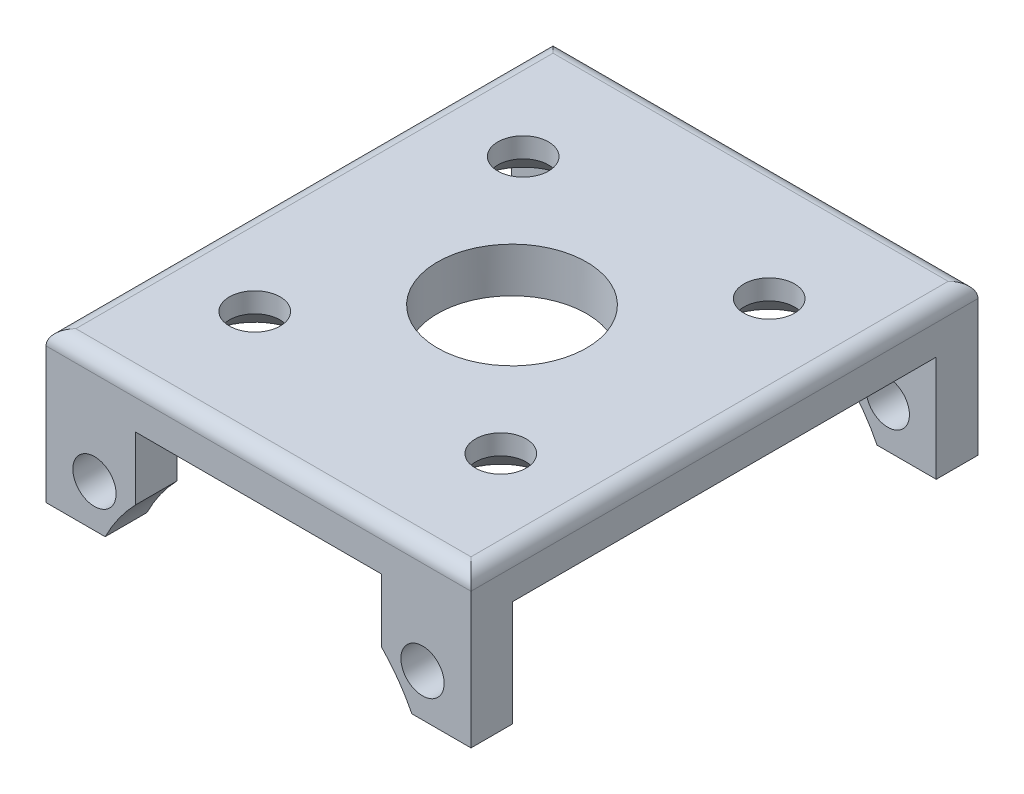
ISO-10303-21;
HEADER;
FILE_DESCRIPTION(('STEP AP214'),'2;1');
FILE_NAME('part.step','',(''),(''),'','','');
FILE_SCHEMA(('AUTOMOTIVE_DESIGN { 1 0 10303 214 1 1 1 1 }'));
ENDSEC;
DATA;
#1=APPLICATION_CONTEXT('core data for automotive mechanical design processes');
#2=APPLICATION_PROTOCOL_DEFINITION('international standard','automotive_design',2000,#1);
#3=PRODUCT_CONTEXT('',#1,'mechanical');
#4=PRODUCT('Part','Part','',(#3));
#5=PRODUCT_RELATED_PRODUCT_CATEGORY('part','',(#4));
#6=PRODUCT_DEFINITION_FORMATION('','',#4);
#7=PRODUCT_DEFINITION_CONTEXT('part definition',#1,'design');
#8=PRODUCT_DEFINITION('design','',#6,#7);
#9=PRODUCT_DEFINITION_SHAPE('','',#8);
#10=(LENGTH_UNIT() NAMED_UNIT(*) SI_UNIT(.MILLI.,.METRE.));
#11=(NAMED_UNIT(*) PLANE_ANGLE_UNIT() SI_UNIT($,.RADIAN.));
#12=(NAMED_UNIT(*) SI_UNIT($,.STERADIAN.) SOLID_ANGLE_UNIT());
#13=UNCERTAINTY_MEASURE_WITH_UNIT(LENGTH_MEASURE(1.E-05),#10,'distance_accuracy_value','');
#14=(GEOMETRIC_REPRESENTATION_CONTEXT(3) GLOBAL_UNCERTAINTY_ASSIGNED_CONTEXT((#13)) GLOBAL_UNIT_ASSIGNED_CONTEXT((#10,
#11,#12)) REPRESENTATION_CONTEXT('',''));
#15=CARTESIAN_POINT('',(0.,0.,0.));
#16=DIRECTION('',(0.,0.,1.));
#17=DIRECTION('',(1.,0.,0.));
#18=AXIS2_PLACEMENT_3D('',#15,#16,#17);
#19=CARTESIAN_POINT('',(8.25000000000001,0.,-17.));
#20=DIRECTION('',(1.,0.,0.));
#21=DIRECTION('',(0.,0.,-1.));
#22=AXIS2_PLACEMENT_3D('',#19,#20,#21);
#23=PLANE('',#22);
#24=DIRECTION('',(0.,0.,1.));
#25=VECTOR('',#24,1.);
#26=CARTESIAN_POINT('',(8.25000000000001,8.01171017948103,-17.));
#27=LINE('',#26,#25);
#28=CARTESIAN_POINT('',(8.25000000000001,8.01171017948103,-17.));
#29=VERTEX_POINT('',#28);
#30=CARTESIAN_POINT('',(8.25000000000001,8.01171017948103,-14.2));
#31=VERTEX_POINT('',#30);
#32=EDGE_CURVE('E271',#29,#31,#27,.T.);
#33=ORIENTED_EDGE('',*,*,#32,.T.);
#34=DIRECTION('',(0.,1.,0.));
#35=VECTOR('',#34,1.);
#36=CARTESIAN_POINT('',(8.25000000000001,0.,-14.2));
#37=LINE('',#36,#35);
#38=CARTESIAN_POINT('',(8.25000000000001,12.25,-14.2));
#39=VERTEX_POINT('',#38);
#40=EDGE_CURVE('E434',#31,#39,#37,.T.);
#41=ORIENTED_EDGE('',*,*,#40,.T.);
#42=DIRECTION('',(0.,0.,1.));
#43=VECTOR('',#42,1.);
#44=CARTESIAN_POINT('',(8.25000000000001,12.25,-17.));
#45=LINE('',#44,#43);
#46=CARTESIAN_POINT('',(8.25000000000001,12.25,-17.));
#47=VERTEX_POINT('',#46);
#48=EDGE_CURVE('E255',#47,#39,#45,.T.);
#49=ORIENTED_EDGE('',*,*,#48,.F.);
#50=DIRECTION('',(0.,1.,0.));
#51=VECTOR('',#50,1.);
#52=CARTESIAN_POINT('',(8.25000000000001,0.,-17.));
#53=LINE('',#52,#51);
#54=EDGE_CURVE('E231',#29,#47,#53,.T.);
#55=ORIENTED_EDGE('',*,*,#54,.F.);
#56=EDGE_LOOP('',(#33,#41,#49,#55));
#57=FACE_BOUND('',#56,.T.);
#58=ADVANCED_FACE('F47',(#57),#23,.F.);
#59=CARTESIAN_POINT('',(-8.25000000000001,0.,-17.));
#60=DIRECTION('',(1.,0.,0.));
#61=DIRECTION('',(0.,0.,-1.));
#62=AXIS2_PLACEMENT_3D('',#59,#60,#61);
#63=PLANE('',#62);
#64=DIRECTION('',(0.,1.,0.));
#65=VECTOR('',#64,1.);
#66=CARTESIAN_POINT('',(-8.25000000000001,0.,-14.2));
#67=LINE('',#66,#65);
#68=CARTESIAN_POINT('',(-8.25000000000001,8.01171017948103,-14.2));
#69=VERTEX_POINT('',#68);
#70=CARTESIAN_POINT('',(-8.25,12.25,-14.2));
#71=VERTEX_POINT('',#70);
#72=EDGE_CURVE('E446',#69,#71,#67,.T.);
#73=ORIENTED_EDGE('',*,*,#72,.F.);
#74=DIRECTION('',(0.,0.,1.));
#75=VECTOR('',#74,1.);
#76=CARTESIAN_POINT('',(-8.25000000000001,8.01171017948103,-17.));
#77=LINE('',#76,#75);
#78=CARTESIAN_POINT('',(-8.25000000000001,8.01171017948103,-17.));
#79=VERTEX_POINT('',#78);
#80=EDGE_CURVE('E266',#79,#69,#77,.T.);
#81=ORIENTED_EDGE('',*,*,#80,.F.);
#82=DIRECTION('',(0.,1.,0.));
#83=VECTOR('',#82,1.);
#84=CARTESIAN_POINT('',(-8.25000000000001,0.,-17.));
#85=LINE('',#84,#83);
#86=CARTESIAN_POINT('',(-8.25000000000001,12.25,-17.));
#87=VERTEX_POINT('',#86);
#88=EDGE_CURVE('E238',#79,#87,#85,.T.);
#89=ORIENTED_EDGE('',*,*,#88,.T.);
#90=DIRECTION('',(0.,0.,1.));
#91=VECTOR('',#90,1.);
#92=CARTESIAN_POINT('',(-8.25000000000001,12.25,-17.));
#93=LINE('',#92,#91);
#94=EDGE_CURVE('E261',#87,#71,#93,.T.);
#95=ORIENTED_EDGE('',*,*,#94,.T.);
#96=EDGE_LOOP('',(#73,#81,#89,#95));
#97=FACE_BOUND('',#96,.T.);
#98=ADVANCED_FACE('F495',(#97),#63,.T.);
#99=CARTESIAN_POINT('',(0.,0.,-17.));
#100=DIRECTION('',(0.,0.,1.));
#101=DIRECTION('',(1.,0.,0.));
#102=AXIS2_PLACEMENT_3D('',#99,#100,#101);
#103=CYLINDRICAL_SURFACE('',#102,11.5);
#104=CARTESIAN_POINT('',(0.,0.,-14.2));
#105=DIRECTION('',(0.,0.,-1.));
#106=DIRECTION('',(0.,1.,0.));
#107=AXIS2_PLACEMENT_3D('',#104,#105,#106);
#108=CIRCLE('',#107,11.5);
#109=CARTESIAN_POINT('',(-10.2823878549683,5.15,-14.2));
#110=VERTEX_POINT('',#109);
#111=EDGE_CURVE('E442',#69,#110,#108,.F.);
#112=ORIENTED_EDGE('',*,*,#111,.T.);
#113=DIRECTION('',(0.,0.,1.));
#114=VECTOR('',#113,1.);
#115=CARTESIAN_POINT('',(-10.2823878549683,5.15,-17.));
#116=LINE('',#115,#114);
#117=CARTESIAN_POINT('',(-10.2823878549683,5.15,-17.));
#118=VERTEX_POINT('',#117);
#119=EDGE_CURVE('E502',#110,#118,#116,.F.);
#120=ORIENTED_EDGE('',*,*,#119,.T.);
#121=CARTESIAN_POINT('',(0.,0.,-17.));
#122=DIRECTION('',(0.,0.,1.));
#123=DIRECTION('',(1.,0.,0.));
#124=AXIS2_PLACEMENT_3D('',#121,#122,#123);
#125=CIRCLE('',#124,11.5);
#126=EDGE_CURVE('E229',#79,#118,#125,.T.);
#127=ORIENTED_EDGE('',*,*,#126,.F.);
#128=ORIENTED_EDGE('',*,*,#80,.T.);
#129=EDGE_LOOP('',(#112,#120,#127,#128));
#130=FACE_BOUND('',#129,.T.);
#131=ADVANCED_FACE('F501',(#130),#103,.F.);
#132=CARTESIAN_POINT('',(-11.,8.,-17.));
#133=DIRECTION('',(0.,0.,1.));
#134=DIRECTION('',(1.,0.,0.));
#135=AXIS2_PLACEMENT_3D('',#132,#133,#134);
#136=CYLINDRICAL_SURFACE('',#135,1.45);
#137=CARTESIAN_POINT('',(-11.,8.,-14.2));
#138=DIRECTION('',(0.,0.,-1.));
#139=DIRECTION('',(0.,1.,0.));
#140=AXIS2_PLACEMENT_3D('',#137,#138,#139);
#141=CIRCLE('',#140,1.45);
#142=CARTESIAN_POINT('',(-11.,9.45,-14.2));
#143=VERTEX_POINT('',#142);
#144=EDGE_CURVE('E438',#143,#143,#141,.F.);
#145=ORIENTED_EDGE('',*,*,#144,.T.);
#146=EDGE_LOOP('',(#145));
#147=FACE_BOUND('',#146,.T.);
#148=CARTESIAN_POINT('',(-11.,8.,-17.));
#149=DIRECTION('',(0.,0.,1.));
#150=DIRECTION('',(1.,0.,0.));
#151=AXIS2_PLACEMENT_3D('',#148,#149,#150);
#152=CIRCLE('',#151,1.45);
#153=CARTESIAN_POINT('',(-9.55000000000001,8.,-17.));
#154=VERTEX_POINT('',#153);
#155=EDGE_CURVE('E246',#154,#154,#152,.T.);
#156=ORIENTED_EDGE('',*,*,#155,.F.);
#157=EDGE_LOOP('',(#156));
#158=FACE_BOUND('',#157,.T.);
#159=ADVANCED_FACE('F618',(#147,#158),#136,.F.);
#160=CARTESIAN_POINT('',(0.,0.,-17.));
#161=DIRECTION('',(0.,0.,1.));
#162=DIRECTION('',(1.,0.,0.));
#163=AXIS2_PLACEMENT_3D('',#160,#161,#162);
#164=CYLINDRICAL_SURFACE('',#163,11.5);
#165=CARTESIAN_POINT('',(0.,0.,-17.));
#166=DIRECTION('',(0.,0.,1.));
#167=DIRECTION('',(1.,0.,0.));
#168=AXIS2_PLACEMENT_3D('',#165,#166,#167);
#169=CIRCLE('',#168,11.5);
#170=CARTESIAN_POINT('',(10.2823878549683,5.15,-17.));
#171=VERTEX_POINT('',#170);
#172=EDGE_CURVE('E225',#171,#29,#169,.T.);
#173=ORIENTED_EDGE('',*,*,#172,.F.);
#174=DIRECTION('',(0.,0.,1.));
#175=VECTOR('',#174,1.);
#176=CARTESIAN_POINT('',(10.2823878549683,5.15,-17.));
#177=LINE('',#176,#175);
#178=CARTESIAN_POINT('',(10.2823878549683,5.15,-14.2));
#179=VERTEX_POINT('',#178);
#180=EDGE_CURVE('E198',#171,#179,#177,.T.);
#181=ORIENTED_EDGE('',*,*,#180,.T.);
#182=CARTESIAN_POINT('',(0.,0.,-14.2));
#183=DIRECTION('',(0.,0.,-1.));
#184=DIRECTION('',(0.,1.,0.));
#185=AXIS2_PLACEMENT_3D('',#182,#183,#184);
#186=CIRCLE('',#185,11.5);
#187=EDGE_CURVE('E285',#179,#31,#186,.F.);
#188=ORIENTED_EDGE('',*,*,#187,.T.);
#189=ORIENTED_EDGE('',*,*,#32,.F.);
#190=EDGE_LOOP('',(#173,#181,#188,#189));
#191=FACE_BOUND('',#190,.T.);
#192=ADVANCED_FACE('F610',(#191),#164,.F.);
#193=CARTESIAN_POINT('',(11.,8.00000000000031,-17.));
#194=DIRECTION('',(0.,0.,1.));
#195=DIRECTION('',(1.,0.,0.));
#196=AXIS2_PLACEMENT_3D('',#193,#194,#195);
#197=CYLINDRICAL_SURFACE('',#196,1.45);
#198=CARTESIAN_POINT('',(11.,8.00000000000031,-14.2));
#199=DIRECTION('',(0.,0.,-1.));
#200=DIRECTION('',(0.,1.,0.));
#201=AXIS2_PLACEMENT_3D('',#198,#199,#200);
#202=CIRCLE('',#201,1.45);
#203=CARTESIAN_POINT('',(11.,9.45000000000031,-14.2));
#204=VERTEX_POINT('',#203);
#205=EDGE_CURVE('E281',#204,#204,#202,.F.);
#206=ORIENTED_EDGE('',*,*,#205,.T.);
#207=EDGE_LOOP('',(#206));
#208=FACE_BOUND('',#207,.T.);
#209=CARTESIAN_POINT('',(11.,8.00000000000031,-17.));
#210=DIRECTION('',(0.,0.,1.));
#211=DIRECTION('',(1.,0.,0.));
#212=AXIS2_PLACEMENT_3D('',#209,#210,#211);
#213=CIRCLE('',#212,1.45);
#214=CARTESIAN_POINT('',(12.45,8.00000000000031,-17.));
#215=VERTEX_POINT('',#214);
#216=EDGE_CURVE('E250',#215,#215,#213,.T.);
#217=ORIENTED_EDGE('',*,*,#216,.F.);
#218=EDGE_LOOP('',(#217));
#219=FACE_BOUND('',#218,.T.);
#220=ADVANCED_FACE('F602',(#208,#219),#197,.F.);
#221=CARTESIAN_POINT('',(8.25000000000001,12.25,14.2));
#222=VERTEX_POINT('',#221);
#223=CARTESIAN_POINT('',(8.25000000000001,12.25,17.));
#224=VERTEX_POINT('',#223);
#225=EDGE_CURVE('E260',#222,#224,#45,.T.);
#226=ORIENTED_EDGE('',*,*,#225,.F.);
#227=DIRECTION('',(0.,-1.,0.));
#228=VECTOR('',#227,1.);
#229=CARTESIAN_POINT('',(8.25000000000001,0.,14.2));
#230=LINE('',#229,#228);
#231=CARTESIAN_POINT('',(8.25000000000001,8.01171017948103,14.2));
#232=VERTEX_POINT('',#231);
#233=EDGE_CURVE('E418',#222,#232,#230,.T.);
#234=ORIENTED_EDGE('',*,*,#233,.T.);
#235=CARTESIAN_POINT('',(8.25000000000001,8.01171017948103,17.));
#236=VERTEX_POINT('',#235);
#237=EDGE_CURVE('E254',#232,#236,#27,.T.);
#238=ORIENTED_EDGE('',*,*,#237,.T.);
#239=DIRECTION('',(0.,1.,0.));
#240=VECTOR('',#239,1.);
#241=CARTESIAN_POINT('',(8.25000000000001,0.,17.));
#242=LINE('',#241,#240);
#243=EDGE_CURVE('E449',#236,#224,#242,.T.);
#244=ORIENTED_EDGE('',*,*,#243,.T.);
#245=EDGE_LOOP('',(#226,#234,#238,#244));
#246=FACE_BOUND('',#245,.T.);
#247=ADVANCED_FACE('F537',(#246),#23,.F.);
#248=CARTESIAN_POINT('',(0.,12.25,-17.));
#249=DIRECTION('',(0.,-1.,0.));
#250=DIRECTION('',(0.,0.,-1.));
#251=AXIS2_PLACEMENT_3D('',#248,#249,#250);
#252=PLANE('',#251);
#253=CARTESIAN_POINT('',(-8.25000000000001,12.25,9.));
#254=DIRECTION('',(0.,-1.,0.));
#255=DIRECTION('',(0.,0.,-1.));
#256=AXIS2_PLACEMENT_3D('',#253,#254,#255);
#257=CIRCLE('',#256,3.36);
#258=CARTESIAN_POINT('',(-8.25000000000001,12.25,5.64));
#259=VERTEX_POINT('',#258);
#260=EDGE_CURVE('E324',#259,#259,#257,.T.);
#261=ORIENTED_EDGE('',*,*,#260,.F.);
#262=EDGE_LOOP('',(#261));
#263=FACE_BOUND('',#262,.T.);
#264=CARTESIAN_POINT('',(8.25000000000001,12.25,9.));
#265=DIRECTION('',(0.,-1.,0.));
#266=DIRECTION('',(0.,0.,-1.));
#267=AXIS2_PLACEMENT_3D('',#264,#265,#266);
#268=CIRCLE('',#267,3.36);
#269=CARTESIAN_POINT('',(8.25000000000001,12.25,5.64));
#270=VERTEX_POINT('',#269);
#271=EDGE_CURVE('E344',#270,#270,#268,.T.);
#272=ORIENTED_EDGE('',*,*,#271,.F.);
#273=EDGE_LOOP('',(#272));
#274=FACE_BOUND('',#273,.T.);
#275=CARTESIAN_POINT('',(-8.25000000000001,12.25,-9.));
#276=DIRECTION('',(0.,-1.,0.));
#277=DIRECTION('',(0.,0.,-1.));
#278=AXIS2_PLACEMENT_3D('',#275,#276,#277);
#279=CIRCLE('',#278,3.36);
#280=CARTESIAN_POINT('',(-8.25000000000001,12.25,-12.36));
#281=VERTEX_POINT('',#280);
#282=EDGE_CURVE('E356',#281,#281,#279,.T.);
#283=ORIENTED_EDGE('',*,*,#282,.F.);
#284=EDGE_LOOP('',(#283));
#285=FACE_BOUND('',#284,.T.);
#286=CARTESIAN_POINT('',(8.25000000000001,12.25,-9.));
#287=DIRECTION('',(0.,-1.,0.));
#288=DIRECTION('',(0.,0.,-1.));
#289=AXIS2_PLACEMENT_3D('',#286,#287,#288);
#290=CIRCLE('',#289,3.36);
#291=CARTESIAN_POINT('',(8.25000000000001,12.25,-12.36));
#292=VERTEX_POINT('',#291);
#293=EDGE_CURVE('E368',#292,#292,#290,.T.);
#294=ORIENTED_EDGE('',*,*,#293,.F.);
#295=EDGE_LOOP('',(#294));
#296=FACE_BOUND('',#295,.T.);
#297=CARTESIAN_POINT('',(0.,12.25,0.));
#298=DIRECTION('',(0.,-1.,0.));
#299=DIRECTION('',(0.,0.,-1.));
#300=AXIS2_PLACEMENT_3D('',#297,#298,#299);
#301=CIRCLE('',#300,5.);
#302=CARTESIAN_POINT('',(0.,12.25,-5.));
#303=VERTEX_POINT('',#302);
#304=EDGE_CURVE('E384',#303,#303,#301,.T.);
#305=ORIENTED_EDGE('',*,*,#304,.F.);
#306=EDGE_LOOP('',(#305));
#307=FACE_BOUND('',#306,.T.);
#308=CARTESIAN_POINT('',(-8.25,12.25,14.2));
#309=VERTEX_POINT('',#308);
#310=CARTESIAN_POINT('',(-8.25000000000001,12.25,17.));
#311=VERTEX_POINT('',#310);
#312=EDGE_CURVE('E265',#309,#311,#93,.T.);
#313=ORIENTED_EDGE('',*,*,#312,.F.);
#314=DIRECTION('',(-1.,0.,0.));
#315=VECTOR('',#314,1.);
#316=CARTESIAN_POINT('',(14.25,12.25,14.2));
#317=LINE('',#316,#315);
#318=CARTESIAN_POINT('',(-14.25,12.25,14.2));
#319=VERTEX_POINT('',#318);
#320=EDGE_CURVE('E398',#309,#319,#317,.T.);
#321=ORIENTED_EDGE('',*,*,#320,.T.);
#322=DIRECTION('',(0.,0.,-1.));
#323=VECTOR('',#322,1.);
#324=CARTESIAN_POINT('',(-14.25,12.25,-14.2));
#325=LINE('',#324,#323);
#326=CARTESIAN_POINT('',(-14.25,12.25,-14.2));
#327=VERTEX_POINT('',#326);
#328=EDGE_CURVE('E392',#319,#327,#325,.T.);
#329=ORIENTED_EDGE('',*,*,#328,.T.);
#330=DIRECTION('',(-1.,0.,0.));
#331=VECTOR('',#330,1.);
#332=CARTESIAN_POINT('',(14.25,12.25,-14.2));
#333=LINE('',#332,#331);
#334=EDGE_CURVE('E410',#71,#327,#333,.T.);
#335=ORIENTED_EDGE('',*,*,#334,.F.);
#336=ORIENTED_EDGE('',*,*,#94,.F.);
#337=DIRECTION('',(1.,0.,0.));
#338=VECTOR('',#337,1.);
#339=CARTESIAN_POINT('',(0.,12.25,-17.));
#340=LINE('',#339,#338);
#341=EDGE_CURVE('E242',#87,#47,#340,.T.);
#342=ORIENTED_EDGE('',*,*,#341,.T.);
#343=ORIENTED_EDGE('',*,*,#48,.T.);
#344=CARTESIAN_POINT('',(14.25,12.25,-14.2));
#345=VERTEX_POINT('',#344);
#346=EDGE_CURVE('E280',#345,#39,#333,.T.);
#347=ORIENTED_EDGE('',*,*,#346,.F.);
#348=DIRECTION('',(0.,0.,-1.));
#349=VECTOR('',#348,1.);
#350=CARTESIAN_POINT('',(14.25,12.25,-14.2));
#351=LINE('',#350,#349);
#352=CARTESIAN_POINT('',(14.25,12.25,14.2));
#353=VERTEX_POINT('',#352);
#354=EDGE_CURVE('E395',#353,#345,#351,.T.);
#355=ORIENTED_EDGE('',*,*,#354,.F.);
#356=EDGE_CURVE('E411',#353,#222,#317,.T.);
#357=ORIENTED_EDGE('',*,*,#356,.T.);
#358=ORIENTED_EDGE('',*,*,#225,.T.);
#359=DIRECTION('',(1.,0.,0.));
#360=VECTOR('',#359,1.);
#361=CARTESIAN_POINT('',(0.,12.25,17.));
#362=LINE('',#361,#360);
#363=EDGE_CURVE('E470',#311,#224,#362,.T.);
#364=ORIENTED_EDGE('',*,*,#363,.F.);
#365=EDGE_LOOP('',(#313,#321,#329,#335,#336,#342,#343,#347,#355,#357,#358,#364));
#366=FACE_BOUND('',#365,.T.);
#367=ADVANCED_FACE('F491',(#263,#274,#285,#296,#307,#366),#252,.T.);
#368=DIRECTION('',(0.,-1.,0.));
#369=VECTOR('',#368,1.);
#370=CARTESIAN_POINT('',(-8.25000000000001,0.,14.2));
#371=LINE('',#370,#369);
#372=CARTESIAN_POINT('',(-8.25000000000001,8.01171017948103,14.2));
#373=VERTEX_POINT('',#372);
#374=EDGE_CURVE('E286',#309,#373,#371,.T.);
#375=ORIENTED_EDGE('',*,*,#374,.F.);
#376=ORIENTED_EDGE('',*,*,#312,.T.);
#377=DIRECTION('',(0.,1.,0.));
#378=VECTOR('',#377,1.);
#379=CARTESIAN_POINT('',(-8.25000000000001,0.,17.));
#380=LINE('',#379,#378);
#381=CARTESIAN_POINT('',(-8.25000000000001,8.01171017948103,17.));
#382=VERTEX_POINT('',#381);
#383=EDGE_CURVE('E466',#382,#311,#380,.T.);
#384=ORIENTED_EDGE('',*,*,#383,.F.);
#385=EDGE_CURVE('E270',#373,#382,#77,.T.);
#386=ORIENTED_EDGE('',*,*,#385,.F.);
#387=EDGE_LOOP('',(#375,#376,#384,#386));
#388=FACE_BOUND('',#387,.T.);
#389=ADVANCED_FACE('F598',(#388),#63,.T.);
#390=CARTESIAN_POINT('',(0.,0.,17.));
#391=DIRECTION('',(0.,0.,1.));
#392=DIRECTION('',(1.,0.,0.));
#393=AXIS2_PLACEMENT_3D('',#390,#391,#392);
#394=CIRCLE('',#393,11.5);
#395=CARTESIAN_POINT('',(-10.2823878549683,5.15,17.));
#396=VERTEX_POINT('',#395);
#397=EDGE_CURVE('E462',#382,#396,#394,.T.);
#398=ORIENTED_EDGE('',*,*,#397,.T.);
#399=DIRECTION('',(0.,0.,1.));
#400=VECTOR('',#399,1.);
#401=CARTESIAN_POINT('',(-10.2823878549683,5.15,-17.));
#402=LINE('',#401,#400);
#403=CARTESIAN_POINT('',(-10.2823878549683,5.15,14.2));
#404=VERTEX_POINT('',#403);
#405=EDGE_CURVE('E512',#396,#404,#402,.F.);
#406=ORIENTED_EDGE('',*,*,#405,.T.);
#407=CARTESIAN_POINT('',(0.,0.,14.2));
#408=DIRECTION('',(0.,0.,1.));
#409=DIRECTION('',(1.,0.,0.));
#410=AXIS2_PLACEMENT_3D('',#407,#408,#409);
#411=CIRCLE('',#410,11.5);
#412=EDGE_CURVE('E426',#404,#373,#411,.F.);
#413=ORIENTED_EDGE('',*,*,#412,.T.);
#414=ORIENTED_EDGE('',*,*,#385,.T.);
#415=EDGE_LOOP('',(#398,#406,#413,#414));
#416=FACE_BOUND('',#415,.T.);
#417=ADVANCED_FACE('F705',(#416),#103,.F.);
#418=CARTESIAN_POINT('',(-14.25,0.,-17.));
#419=DIRECTION('',(1.,0.,0.));
#420=DIRECTION('',(0.,1.,0.));
#421=AXIS2_PLACEMENT_3D('',#418,#419,#420);
#422=PLANE('',#421);
#423=DIRECTION('',(0.,1.,0.));
#424=VECTOR('',#423,1.);
#425=CARTESIAN_POINT('',(-14.25,0.,-17.));
#426=LINE('',#425,#424);
#427=CARTESIAN_POINT('',(-14.25,5.15,-17.));
#428=VERTEX_POINT('',#427);
#429=CARTESIAN_POINT('',(-14.25,14.25,-17.));
#430=VERTEX_POINT('',#429);
#431=EDGE_CURVE('E224',#428,#430,#426,.T.);
#432=ORIENTED_EDGE('',*,*,#431,.F.);
#433=DIRECTION('',(0.,0.,1.));
#434=VECTOR('',#433,1.);
#435=CARTESIAN_POINT('',(-14.25,5.15,-17.));
#436=LINE('',#435,#434);
#437=CARTESIAN_POINT('',(-14.25,5.15,-14.2));
#438=VERTEX_POINT('',#437);
#439=EDGE_CURVE('E548',#428,#438,#436,.T.);
#440=ORIENTED_EDGE('',*,*,#439,.T.);
#441=DIRECTION('',(0.,-1.,0.));
#442=VECTOR('',#441,1.);
#443=CARTESIAN_POINT('',(-14.25,12.25,-14.2));
#444=LINE('',#443,#442);
#445=EDGE_CURVE('E388',#327,#438,#444,.T.);
#446=ORIENTED_EDGE('',*,*,#445,.F.);
#447=ORIENTED_EDGE('',*,*,#328,.F.);
#448=DIRECTION('',(0.,1.,0.));
#449=VECTOR('',#448,1.);
#450=CARTESIAN_POINT('',(-14.25,12.25,14.2));
#451=LINE('',#450,#449);
#452=CARTESIAN_POINT('',(-14.25,5.15,14.2));
#453=VERTEX_POINT('',#452);
#454=EDGE_CURVE('E402',#453,#319,#451,.T.);
#455=ORIENTED_EDGE('',*,*,#454,.F.);
#456=CARTESIAN_POINT('',(-14.25,5.15,17.));
#457=VERTEX_POINT('',#456);
#458=EDGE_CURVE('E216',#453,#457,#436,.T.);
#459=ORIENTED_EDGE('',*,*,#458,.T.);
#460=DIRECTION('',(0.,1.,0.));
#461=VECTOR('',#460,1.);
#462=CARTESIAN_POINT('',(-14.25,0.,17.));
#463=LINE('',#462,#461);
#464=CARTESIAN_POINT('',(-14.25,14.25,17.));
#465=VERTEX_POINT('',#464);
#466=EDGE_CURVE('E459',#457,#465,#463,.T.);
#467=ORIENTED_EDGE('',*,*,#466,.T.);
#468=DIRECTION('',(0.,0.,1.));
#469=VECTOR('',#468,1.);
#470=CARTESIAN_POINT('',(-14.25,14.25,-17.));
#471=LINE('',#470,#469);
#472=EDGE_CURVE('E302',#465,#430,#471,.F.);
#473=ORIENTED_EDGE('',*,*,#472,.T.);
#474=EDGE_LOOP('',(#432,#440,#446,#447,#455,#459,#467,#473));
#475=FACE_BOUND('',#474,.T.);
#476=ADVANCED_FACE('F562',(#475),#422,.F.);
#477=CARTESIAN_POINT('',(0.,15.25,-17.));
#478=DIRECTION('',(0.,1.,0.));
#479=DIRECTION('',(0.,0.,1.));
#480=AXIS2_PLACEMENT_3D('',#477,#478,#479);
#481=PLANE('',#480);
#482=DIRECTION('',(0.,0.,1.));
#483=VECTOR('',#482,1.);
#484=CARTESIAN_POINT('',(13.25,15.25,-17.));
#485=LINE('',#484,#483);
#486=CARTESIAN_POINT('',(13.25,15.25,16.));
#487=VERTEX_POINT('',#486);
#488=CARTESIAN_POINT('',(13.25,15.25,-16.));
#489=VERTEX_POINT('',#488);
#490=EDGE_CURVE('E295',#487,#489,#485,.F.);
#491=ORIENTED_EDGE('',*,*,#490,.T.);
#492=DIRECTION('',(-1.,0.,0.));
#493=VECTOR('',#492,1.);
#494=CARTESIAN_POINT('',(-14.25,15.25,-16.));
#495=LINE('',#494,#493);
#496=CARTESIAN_POINT('',(-13.25,15.25,-16.));
#497=VERTEX_POINT('',#496);
#498=EDGE_CURVE('E299',#489,#497,#495,.T.);
#499=ORIENTED_EDGE('',*,*,#498,.T.);
#500=DIRECTION('',(0.,0.,1.));
#501=VECTOR('',#500,1.);
#502=CARTESIAN_POINT('',(-13.25,15.25,17.));
#503=LINE('',#502,#501);
#504=CARTESIAN_POINT('',(-13.25,15.25,16.));
#505=VERTEX_POINT('',#504);
#506=EDGE_CURVE('E292',#497,#505,#503,.T.);
#507=ORIENTED_EDGE('',*,*,#506,.T.);
#508=DIRECTION('',(-1.,0.,0.));
#509=VECTOR('',#508,1.);
#510=CARTESIAN_POINT('',(0.,15.25,16.));
#511=LINE('',#510,#509);
#512=EDGE_CURVE('E289',#505,#487,#511,.F.);
#513=ORIENTED_EDGE('',*,*,#512,.T.);
#514=EDGE_LOOP('',(#491,#499,#507,#513));
#515=FACE_BOUND('',#514,.T.);
#516=CARTESIAN_POINT('',(-8.25000000000001,15.25,9.));
#517=DIRECTION('',(0.,-1.,0.));
#518=DIRECTION('',(0.,0.,-1.));
#519=AXIS2_PLACEMENT_3D('',#516,#517,#518);
#520=CIRCLE('',#519,1.7);
#521=CARTESIAN_POINT('',(-8.25000000000001,15.25,7.3));
#522=VERTEX_POINT('',#521);
#523=EDGE_CURVE('E336',#522,#522,#520,.T.);
#524=ORIENTED_EDGE('',*,*,#523,.T.);
#525=EDGE_LOOP('',(#524));
#526=FACE_BOUND('',#525,.T.);
#527=CARTESIAN_POINT('',(8.25000000000001,15.25,9.));
#528=DIRECTION('',(0.,-1.,0.));
#529=DIRECTION('',(0.,0.,-1.));
#530=AXIS2_PLACEMENT_3D('',#527,#528,#529);
#531=CIRCLE('',#530,1.7);
#532=CARTESIAN_POINT('',(8.25000000000001,15.25,7.3));
#533=VERTEX_POINT('',#532);
#534=EDGE_CURVE('E352',#533,#533,#531,.T.);
#535=ORIENTED_EDGE('',*,*,#534,.T.);
#536=EDGE_LOOP('',(#535));
#537=FACE_BOUND('',#536,.T.);
#538=CARTESIAN_POINT('',(-8.25000000000001,15.25,-9.));
#539=DIRECTION('',(0.,-1.,0.));
#540=DIRECTION('',(0.,0.,-1.));
#541=AXIS2_PLACEMENT_3D('',#538,#539,#540);
#542=CIRCLE('',#541,1.7);
#543=CARTESIAN_POINT('',(-8.25000000000001,15.25,-10.7));
#544=VERTEX_POINT('',#543);
#545=EDGE_CURVE('E364',#544,#544,#542,.T.);
#546=ORIENTED_EDGE('',*,*,#545,.T.);
#547=EDGE_LOOP('',(#546));
#548=FACE_BOUND('',#547,.T.);
#549=CARTESIAN_POINT('',(8.25000000000001,15.25,-9.));
#550=DIRECTION('',(0.,-1.,0.));
#551=DIRECTION('',(0.,0.,-1.));
#552=AXIS2_PLACEMENT_3D('',#549,#550,#551);
#553=CIRCLE('',#552,1.7);
#554=CARTESIAN_POINT('',(8.25000000000001,15.25,-10.7));
#555=VERTEX_POINT('',#554);
#556=EDGE_CURVE('E376',#555,#555,#553,.T.);
#557=ORIENTED_EDGE('',*,*,#556,.T.);
#558=EDGE_LOOP('',(#557));
#559=FACE_BOUND('',#558,.T.);
#560=CARTESIAN_POINT('',(0.,15.25,0.));
#561=DIRECTION('',(0.,1.,0.));
#562=DIRECTION('',(0.,0.,1.));
#563=AXIS2_PLACEMENT_3D('',#560,#561,#562);
#564=CIRCLE('',#563,5.);
#565=CARTESIAN_POINT('',(0.,15.25,5.));
#566=VERTEX_POINT('',#565);
#567=EDGE_CURVE('E380',#566,#566,#564,.T.);
#568=ORIENTED_EDGE('',*,*,#567,.F.);
#569=EDGE_LOOP('',(#568));
#570=FACE_BOUND('',#569,.T.);
#571=ADVANCED_FACE('F579',(#515,#526,#537,#548,#559,#570),#481,.T.);
#572=CARTESIAN_POINT('',(14.25,0.,-17.));
#573=DIRECTION('',(1.,0.,0.));
#574=DIRECTION('',(0.,1.,0.));
#575=AXIS2_PLACEMENT_3D('',#572,#573,#574);
#576=PLANE('',#575);
#577=DIRECTION('',(0.,0.,1.));
#578=VECTOR('',#577,1.);
#579=CARTESIAN_POINT('',(14.25,5.15,-17.));
#580=LINE('',#579,#578);
#581=CARTESIAN_POINT('',(14.25,5.15,-17.));
#582=VERTEX_POINT('',#581);
#583=CARTESIAN_POINT('',(14.25,5.15,-14.2));
#584=VERTEX_POINT('',#583);
#585=EDGE_CURVE('E71',#582,#584,#580,.T.);
#586=ORIENTED_EDGE('',*,*,#585,.F.);
#587=DIRECTION('',(0.,1.,0.));
#588=VECTOR('',#587,1.);
#589=CARTESIAN_POINT('',(14.25,0.,-17.));
#590=LINE('',#589,#588);
#591=CARTESIAN_POINT('',(14.25,14.25,-17.));
#592=VERTEX_POINT('',#591);
#593=EDGE_CURVE('E210',#582,#592,#590,.T.);
#594=ORIENTED_EDGE('',*,*,#593,.T.);
#595=DIRECTION('',(0.,0.,1.));
#596=VECTOR('',#595,1.);
#597=CARTESIAN_POINT('',(14.25,14.25,-17.));
#598=LINE('',#597,#596);
#599=CARTESIAN_POINT('',(14.25,14.25,17.));
#600=VERTEX_POINT('',#599);
#601=EDGE_CURVE('E259',#592,#600,#598,.T.);
#602=ORIENTED_EDGE('',*,*,#601,.T.);
#603=DIRECTION('',(0.,1.,0.));
#604=VECTOR('',#603,1.);
#605=CARTESIAN_POINT('',(14.25,0.,17.));
#606=LINE('',#605,#604);
#607=CARTESIAN_POINT('',(14.25,5.15,17.));
#608=VERTEX_POINT('',#607);
#609=EDGE_CURVE('E456',#608,#600,#606,.T.);
#610=ORIENTED_EDGE('',*,*,#609,.F.);
#611=CARTESIAN_POINT('',(14.25,5.15,14.2));
#612=VERTEX_POINT('',#611);
#613=EDGE_CURVE('E203',#612,#608,#580,.T.);
#614=ORIENTED_EDGE('',*,*,#613,.F.);
#615=DIRECTION('',(0.,1.,0.));
#616=VECTOR('',#615,1.);
#617=CARTESIAN_POINT('',(14.25,12.25,14.2));
#618=LINE('',#617,#616);
#619=EDGE_CURVE('E391',#612,#353,#618,.T.);
#620=ORIENTED_EDGE('',*,*,#619,.T.);
#621=ORIENTED_EDGE('',*,*,#354,.T.);
#622=DIRECTION('',(0.,-1.,0.));
#623=VECTOR('',#622,1.);
#624=CARTESIAN_POINT('',(14.25,12.25,-14.2));
#625=LINE('',#624,#623);
#626=EDGE_CURVE('E214',#345,#584,#625,.T.);
#627=ORIENTED_EDGE('',*,*,#626,.T.);
#628=EDGE_LOOP('',(#586,#594,#602,#610,#614,#620,#621,#627));
#629=FACE_BOUND('',#628,.T.);
#630=ADVANCED_FACE('F208',(#629),#576,.T.);
#631=CARTESIAN_POINT('',(-11.,8.,14.2));
#632=DIRECTION('',(0.,0.,1.));
#633=DIRECTION('',(1.,0.,0.));
#634=AXIS2_PLACEMENT_3D('',#631,#632,#633);
#635=CIRCLE('',#634,1.45);
#636=CARTESIAN_POINT('',(-9.55000000000001,8.,14.2));
#637=VERTEX_POINT('',#636);
#638=EDGE_CURVE('E422',#637,#637,#635,.F.);
#639=ORIENTED_EDGE('',*,*,#638,.T.);
#640=EDGE_LOOP('',(#639));
#641=FACE_BOUND('',#640,.T.);
#642=CARTESIAN_POINT('',(-11.,8.,17.));
#643=DIRECTION('',(0.,0.,1.));
#644=DIRECTION('',(1.,0.,0.));
#645=AXIS2_PLACEMENT_3D('',#642,#643,#644);
#646=CIRCLE('',#645,1.45);
#647=CARTESIAN_POINT('',(-9.55000000000001,8.,17.));
#648=VERTEX_POINT('',#647);
#649=EDGE_CURVE('E474',#648,#648,#646,.T.);
#650=ORIENTED_EDGE('',*,*,#649,.T.);
#651=EDGE_LOOP('',(#650));
#652=FACE_BOUND('',#651,.T.);
#653=ADVANCED_FACE('F631',(#641,#652),#136,.F.);
#654=CARTESIAN_POINT('',(0.,0.,14.2));
#655=DIRECTION('',(0.,0.,1.));
#656=DIRECTION('',(1.,0.,0.));
#657=AXIS2_PLACEMENT_3D('',#654,#655,#656);
#658=CIRCLE('',#657,11.5);
#659=CARTESIAN_POINT('',(10.2823878549683,5.15,14.2));
#660=VERTEX_POINT('',#659);
#661=EDGE_CURVE('E279',#232,#660,#658,.F.);
#662=ORIENTED_EDGE('',*,*,#661,.T.);
#663=DIRECTION('',(0.,0.,1.));
#664=VECTOR('',#663,1.);
#665=CARTESIAN_POINT('',(10.2823878549683,5.15,-17.));
#666=LINE('',#665,#664);
#667=CARTESIAN_POINT('',(10.2823878549683,5.15,17.));
#668=VERTEX_POINT('',#667);
#669=EDGE_CURVE('E63',#660,#668,#666,.T.);
#670=ORIENTED_EDGE('',*,*,#669,.T.);
#671=CARTESIAN_POINT('',(0.,0.,17.));
#672=DIRECTION('',(0.,0.,1.));
#673=DIRECTION('',(1.,0.,0.));
#674=AXIS2_PLACEMENT_3D('',#671,#672,#673);
#675=CIRCLE('',#674,11.5);
#676=EDGE_CURVE('E453',#668,#236,#675,.T.);
#677=ORIENTED_EDGE('',*,*,#676,.T.);
#678=ORIENTED_EDGE('',*,*,#237,.F.);
#679=EDGE_LOOP('',(#662,#670,#677,#678));
#680=FACE_BOUND('',#679,.T.);
#681=ADVANCED_FACE('F524',(#680),#164,.F.);
#682=CARTESIAN_POINT('',(11.,8.00000000000031,14.2));
#683=DIRECTION('',(0.,0.,1.));
#684=DIRECTION('',(1.,0.,0.));
#685=AXIS2_PLACEMENT_3D('',#682,#683,#684);
#686=CIRCLE('',#685,1.45);
#687=CARTESIAN_POINT('',(12.45,8.00000000000031,14.2));
#688=VERTEX_POINT('',#687);
#689=EDGE_CURVE('E275',#688,#688,#686,.F.);
#690=ORIENTED_EDGE('',*,*,#689,.T.);
#691=EDGE_LOOP('',(#690));
#692=FACE_BOUND('',#691,.T.);
#693=CARTESIAN_POINT('',(11.,8.00000000000031,17.));
#694=DIRECTION('',(0.,0.,1.));
#695=DIRECTION('',(1.,0.,0.));
#696=AXIS2_PLACEMENT_3D('',#693,#694,#695);
#697=CIRCLE('',#696,1.45);
#698=CARTESIAN_POINT('',(12.45,8.00000000000031,17.));
#699=VERTEX_POINT('',#698);
#700=EDGE_CURVE('E478',#699,#699,#697,.T.);
#701=ORIENTED_EDGE('',*,*,#700,.T.);
#702=EDGE_LOOP('',(#701));
#703=FACE_BOUND('',#702,.T.);
#704=ADVANCED_FACE('F613',(#692,#703),#197,.F.);
#705=CARTESIAN_POINT('',(0.,0.,-17.));
#706=DIRECTION('',(0.,0.,1.));
#707=DIRECTION('',(1.,0.,0.));
#708=AXIS2_PLACEMENT_3D('',#705,#706,#707);
#709=PLANE('',#708);
#710=ORIENTED_EDGE('',*,*,#593,.F.);
#711=DIRECTION('',(-1.,0.,0.));
#712=VECTOR('',#711,1.);
#713=CARTESIAN_POINT('',(-14.25,5.15,-17.));
#714=LINE('',#713,#712);
#715=EDGE_CURVE('E195',#582,#171,#714,.T.);
#716=ORIENTED_EDGE('',*,*,#715,.T.);
#717=ORIENTED_EDGE('',*,*,#172,.T.);
#718=ORIENTED_EDGE('',*,*,#54,.T.);
#719=ORIENTED_EDGE('',*,*,#341,.F.);
#720=ORIENTED_EDGE('',*,*,#88,.F.);
#721=ORIENTED_EDGE('',*,*,#126,.T.);
#722=EDGE_CURVE('E204',#118,#428,#714,.T.);
#723=ORIENTED_EDGE('',*,*,#722,.T.);
#724=ORIENTED_EDGE('',*,*,#431,.T.);
#725=DIRECTION('',(-1.,0.,0.));
#726=VECTOR('',#725,1.);
#727=CARTESIAN_POINT('',(14.25,14.25,-17.));
#728=LINE('',#727,#726);
#729=EDGE_CURVE('E221',#430,#592,#728,.F.);
#730=ORIENTED_EDGE('',*,*,#729,.T.);
#731=EDGE_LOOP('',(#710,#716,#717,#718,#719,#720,#721,#723,#724,#730));
#732=FACE_BOUND('',#731,.T.);
#733=ORIENTED_EDGE('',*,*,#155,.T.);
#734=EDGE_LOOP('',(#733));
#735=FACE_BOUND('',#734,.T.);
#736=ORIENTED_EDGE('',*,*,#216,.T.);
#737=EDGE_LOOP('',(#736));
#738=FACE_BOUND('',#737,.T.);
#739=ADVANCED_FACE('F218',(#732,#735,#738),#709,.F.);
#740=CARTESIAN_POINT('',(0.,0.,17.));
#741=DIRECTION('',(0.,0.,1.));
#742=DIRECTION('',(1.,0.,0.));
#743=AXIS2_PLACEMENT_3D('',#740,#741,#742);
#744=PLANE('',#743);
#745=DIRECTION('',(-1.,0.,0.));
#746=VECTOR('',#745,1.);
#747=CARTESIAN_POINT('',(-14.25,5.15,17.));
#748=LINE('',#747,#746);
#749=EDGE_CURVE('E532',#608,#668,#748,.T.);
#750=ORIENTED_EDGE('',*,*,#749,.F.);
#751=ORIENTED_EDGE('',*,*,#609,.T.);
#752=DIRECTION('',(-1.,0.,0.));
#753=VECTOR('',#752,1.);
#754=CARTESIAN_POINT('',(0.,14.25,17.));
#755=LINE('',#754,#753);
#756=EDGE_CURVE('E56',#600,#465,#755,.T.);
#757=ORIENTED_EDGE('',*,*,#756,.T.);
#758=ORIENTED_EDGE('',*,*,#466,.F.);
#759=EDGE_CURVE('E567',#396,#457,#748,.T.);
#760=ORIENTED_EDGE('',*,*,#759,.F.);
#761=ORIENTED_EDGE('',*,*,#397,.F.);
#762=ORIENTED_EDGE('',*,*,#383,.T.);
#763=ORIENTED_EDGE('',*,*,#363,.T.);
#764=ORIENTED_EDGE('',*,*,#243,.F.);
#765=ORIENTED_EDGE('',*,*,#676,.F.);
#766=EDGE_LOOP('',(#750,#751,#757,#758,#760,#761,#762,#763,#764,#765));
#767=FACE_BOUND('',#766,.T.);
#768=ORIENTED_EDGE('',*,*,#649,.F.);
#769=EDGE_LOOP('',(#768));
#770=FACE_BOUND('',#769,.T.);
#771=ORIENTED_EDGE('',*,*,#700,.F.);
#772=EDGE_LOOP('',(#771));
#773=FACE_BOUND('',#772,.T.);
#774=ADVANCED_FACE('F530',(#767,#770,#773),#744,.T.);
#775=CARTESIAN_POINT('',(14.25,12.25,14.2));
#776=DIRECTION('',(0.,0.,1.));
#777=DIRECTION('',(1.,0.,0.));
#778=AXIS2_PLACEMENT_3D('',#775,#776,#777);
#779=PLANE('',#778);
#780=ORIENTED_EDGE('',*,*,#689,.F.);
#781=EDGE_LOOP('',(#780));
#782=FACE_BOUND('',#781,.T.);
#783=ORIENTED_EDGE('',*,*,#619,.F.);
#784=DIRECTION('',(-1.,0.,0.));
#785=VECTOR('',#784,1.);
#786=CARTESIAN_POINT('',(14.25,5.15,14.2));
#787=LINE('',#786,#785);
#788=EDGE_CURVE('E517',#612,#660,#787,.T.);
#789=ORIENTED_EDGE('',*,*,#788,.T.);
#790=ORIENTED_EDGE('',*,*,#661,.F.);
#791=ORIENTED_EDGE('',*,*,#233,.F.);
#792=ORIENTED_EDGE('',*,*,#356,.F.);
#793=EDGE_LOOP('',(#783,#789,#790,#791,#792));
#794=FACE_BOUND('',#793,.T.);
#795=ADVANCED_FACE('F544',(#782,#794),#779,.F.);
#796=CARTESIAN_POINT('',(14.25,12.25,-14.2));
#797=DIRECTION('',(0.,0.,-1.));
#798=DIRECTION('',(0.,1.,0.));
#799=AXIS2_PLACEMENT_3D('',#796,#797,#798);
#800=PLANE('',#799);
#801=ORIENTED_EDGE('',*,*,#205,.F.);
#802=EDGE_LOOP('',(#801));
#803=FACE_BOUND('',#802,.T.);
#804=ORIENTED_EDGE('',*,*,#187,.F.);
#805=DIRECTION('',(1.,0.,0.));
#806=VECTOR('',#805,1.);
#807=CARTESIAN_POINT('',(14.25,5.15,-14.2));
#808=LINE('',#807,#806);
#809=EDGE_CURVE('E506',#179,#584,#808,.T.);
#810=ORIENTED_EDGE('',*,*,#809,.T.);
#811=ORIENTED_EDGE('',*,*,#626,.F.);
#812=ORIENTED_EDGE('',*,*,#346,.T.);
#813=ORIENTED_EDGE('',*,*,#40,.F.);
#814=EDGE_LOOP('',(#804,#810,#811,#812,#813));
#815=FACE_BOUND('',#814,.T.);
#816=ADVANCED_FACE('F641',(#803,#815),#800,.F.);
#817=ORIENTED_EDGE('',*,*,#445,.T.);
#818=DIRECTION('',(1.,0.,0.));
#819=VECTOR('',#818,1.);
#820=CARTESIAN_POINT('',(14.25,5.15,-14.2));
#821=LINE('',#820,#819);
#822=EDGE_CURVE('E507',#438,#110,#821,.T.);
#823=ORIENTED_EDGE('',*,*,#822,.T.);
#824=ORIENTED_EDGE('',*,*,#111,.F.);
#825=ORIENTED_EDGE('',*,*,#72,.T.);
#826=ORIENTED_EDGE('',*,*,#334,.T.);
#827=EDGE_LOOP('',(#817,#823,#824,#825,#826));
#828=FACE_BOUND('',#827,.T.);
#829=ORIENTED_EDGE('',*,*,#144,.F.);
#830=EDGE_LOOP('',(#829));
#831=FACE_BOUND('',#830,.T.);
#832=ADVANCED_FACE('F646',(#828,#831),#800,.F.);
#833=ORIENTED_EDGE('',*,*,#412,.F.);
#834=DIRECTION('',(-1.,0.,0.));
#835=VECTOR('',#834,1.);
#836=CARTESIAN_POINT('',(14.25,5.15,14.2));
#837=LINE('',#836,#835);
#838=EDGE_CURVE('E11',#404,#453,#837,.T.);
#839=ORIENTED_EDGE('',*,*,#838,.T.);
#840=ORIENTED_EDGE('',*,*,#454,.T.);
#841=ORIENTED_EDGE('',*,*,#320,.F.);
#842=ORIENTED_EDGE('',*,*,#374,.T.);
#843=EDGE_LOOP('',(#833,#839,#840,#841,#842));
#844=FACE_BOUND('',#843,.T.);
#845=ORIENTED_EDGE('',*,*,#638,.F.);
#846=EDGE_LOOP('',(#845));
#847=FACE_BOUND('',#846,.T.);
#848=ADVANCED_FACE('F644',(#844,#847),#779,.F.);
#849=CARTESIAN_POINT('',(0.,4.74999999999999,0.));
#850=DIRECTION('',(0.,1.,0.));
#851=DIRECTION('',(0.,0.,1.));
#852=AXIS2_PLACEMENT_3D('',#849,#850,#851);
#853=CYLINDRICAL_SURFACE('',#852,5.);
#854=ORIENTED_EDGE('',*,*,#304,.T.);
#855=EDGE_LOOP('',(#854));
#856=FACE_BOUND('',#855,.T.);
#857=ORIENTED_EDGE('',*,*,#567,.T.);
#858=EDGE_LOOP('',(#857));
#859=FACE_BOUND('',#858,.T.);
#860=ADVANCED_FACE('F651',(#856,#859),#853,.F.);
#861=CARTESIAN_POINT('',(8.25000000000001,12.25,-9.));
#862=DIRECTION('',(0.,-1.,0.));
#863=DIRECTION('',(0.,0.,-1.));
#864=AXIS2_PLACEMENT_3D('',#861,#862,#863);
#865=CYLINDRICAL_SURFACE('',#864,1.69999999999999);
#866=ORIENTED_EDGE('',*,*,#556,.F.);
#867=EDGE_LOOP('',(#866));
#868=FACE_BOUND('',#867,.T.);
#869=CARTESIAN_POINT('',(8.25000000000001,13.91,-9.));
#870=DIRECTION('',(0.,-1.,0.));
#871=DIRECTION('',(0.,0.,-1.));
#872=AXIS2_PLACEMENT_3D('',#869,#870,#871);
#873=CIRCLE('',#872,1.69999999999999);
#874=CARTESIAN_POINT('',(8.25000000000001,13.91,-10.7));
#875=VERTEX_POINT('',#874);
#876=EDGE_CURVE('E372',#875,#875,#873,.T.);
#877=ORIENTED_EDGE('',*,*,#876,.T.);
#878=EDGE_LOOP('',(#877));
#879=FACE_BOUND('',#878,.T.);
#880=ADVANCED_FACE('F654',(#868,#879),#865,.F.);
#881=CARTESIAN_POINT('',(8.25000000000001,12.25,-9.));
#882=DIRECTION('',(0.,-1.,0.));
#883=DIRECTION('',(0.,0.,-1.));
#884=AXIS2_PLACEMENT_3D('',#881,#882,#883);
#885=CONICAL_SURFACE('',#884,3.36,0.785398163397445);
#886=ORIENTED_EDGE('',*,*,#876,.F.);
#887=EDGE_LOOP('',(#886));
#888=FACE_BOUND('',#887,.T.);
#889=ORIENTED_EDGE('',*,*,#293,.T.);
#890=EDGE_LOOP('',(#889));
#891=FACE_BOUND('',#890,.T.);
#892=ADVANCED_FACE('F658',(#888,#891),#885,.F.);
#893=CARTESIAN_POINT('',(-8.25000000000001,12.25,-9.));
#894=DIRECTION('',(0.,-1.,0.));
#895=DIRECTION('',(0.,0.,-1.));
#896=AXIS2_PLACEMENT_3D('',#893,#894,#895);
#897=CYLINDRICAL_SURFACE('',#896,1.69999999999999);
#898=ORIENTED_EDGE('',*,*,#545,.F.);
#899=EDGE_LOOP('',(#898));
#900=FACE_BOUND('',#899,.T.);
#901=CARTESIAN_POINT('',(-8.25000000000001,13.91,-9.));
#902=DIRECTION('',(0.,-1.,0.));
#903=DIRECTION('',(0.,0.,-1.));
#904=AXIS2_PLACEMENT_3D('',#901,#902,#903);
#905=CIRCLE('',#904,1.69999999999999);
#906=CARTESIAN_POINT('',(-8.25000000000001,13.91,-10.7));
#907=VERTEX_POINT('',#906);
#908=EDGE_CURVE('E360',#907,#907,#905,.T.);
#909=ORIENTED_EDGE('',*,*,#908,.T.);
#910=EDGE_LOOP('',(#909));
#911=FACE_BOUND('',#910,.T.);
#912=ADVANCED_FACE('F662',(#900,#911),#897,.F.);
#913=CARTESIAN_POINT('',(-8.25000000000001,12.25,-9.));
#914=DIRECTION('',(0.,-1.,0.));
#915=DIRECTION('',(0.,0.,-1.));
#916=AXIS2_PLACEMENT_3D('',#913,#914,#915);
#917=CONICAL_SURFACE('',#916,3.36,0.785398163397445);
#918=ORIENTED_EDGE('',*,*,#908,.F.);
#919=EDGE_LOOP('',(#918));
#920=FACE_BOUND('',#919,.T.);
#921=ORIENTED_EDGE('',*,*,#282,.T.);
#922=EDGE_LOOP('',(#921));
#923=FACE_BOUND('',#922,.T.);
#924=ADVANCED_FACE('F666',(#920,#923),#917,.F.);
#925=CARTESIAN_POINT('',(8.25000000000001,12.25,9.));
#926=DIRECTION('',(0.,-1.,0.));
#927=DIRECTION('',(0.,0.,-1.));
#928=AXIS2_PLACEMENT_3D('',#925,#926,#927);
#929=CYLINDRICAL_SURFACE('',#928,1.69999999999999);
#930=ORIENTED_EDGE('',*,*,#534,.F.);
#931=EDGE_LOOP('',(#930));
#932=FACE_BOUND('',#931,.T.);
#933=CARTESIAN_POINT('',(8.25000000000001,13.91,9.));
#934=DIRECTION('',(0.,-1.,0.));
#935=DIRECTION('',(0.,0.,-1.));
#936=AXIS2_PLACEMENT_3D('',#933,#934,#935);
#937=CIRCLE('',#936,1.69999999999999);
#938=CARTESIAN_POINT('',(8.25000000000001,13.91,7.30000000000001));
#939=VERTEX_POINT('',#938);
#940=EDGE_CURVE('E348',#939,#939,#937,.T.);
#941=ORIENTED_EDGE('',*,*,#940,.T.);
#942=EDGE_LOOP('',(#941));
#943=FACE_BOUND('',#942,.T.);
#944=ADVANCED_FACE('F670',(#932,#943),#929,.F.);
#945=CARTESIAN_POINT('',(8.25000000000001,12.25,9.));
#946=DIRECTION('',(0.,-1.,0.));
#947=DIRECTION('',(0.,0.,-1.));
#948=AXIS2_PLACEMENT_3D('',#945,#946,#947);
#949=CONICAL_SURFACE('',#948,3.36,0.785398163397445);
#950=ORIENTED_EDGE('',*,*,#940,.F.);
#951=EDGE_LOOP('',(#950));
#952=FACE_BOUND('',#951,.T.);
#953=ORIENTED_EDGE('',*,*,#271,.T.);
#954=EDGE_LOOP('',(#953));
#955=FACE_BOUND('',#954,.T.);
#956=ADVANCED_FACE('F674',(#952,#955),#949,.F.);
#957=CARTESIAN_POINT('',(-8.25000000000001,12.25,9.));
#958=DIRECTION('',(0.,-1.,0.));
#959=DIRECTION('',(0.,0.,-1.));
#960=AXIS2_PLACEMENT_3D('',#957,#958,#959);
#961=CYLINDRICAL_SURFACE('',#960,1.69999999999999);
#962=ORIENTED_EDGE('',*,*,#523,.F.);
#963=EDGE_LOOP('',(#962));
#964=FACE_BOUND('',#963,.T.);
#965=CARTESIAN_POINT('',(-8.25000000000001,13.91,9.));
#966=DIRECTION('',(0.,-1.,0.));
#967=DIRECTION('',(0.,0.,-1.));
#968=AXIS2_PLACEMENT_3D('',#965,#966,#967);
#969=CIRCLE('',#968,1.69999999999999);
#970=CARTESIAN_POINT('',(-8.25000000000001,13.91,7.30000000000001));
#971=VERTEX_POINT('',#970);
#972=EDGE_CURVE('E330',#971,#971,#969,.T.);
#973=ORIENTED_EDGE('',*,*,#972,.T.);
#974=EDGE_LOOP('',(#973));
#975=FACE_BOUND('',#974,.T.);
#976=ADVANCED_FACE('F678',(#964,#975),#961,.F.);
#977=CARTESIAN_POINT('',(-8.25000000000001,12.25,9.));
#978=DIRECTION('',(0.,-1.,0.));
#979=DIRECTION('',(0.,0.,-1.));
#980=AXIS2_PLACEMENT_3D('',#977,#978,#979);
#981=CONICAL_SURFACE('',#980,3.36,0.785398163397445);
#982=ORIENTED_EDGE('',*,*,#972,.F.);
#983=EDGE_LOOP('',(#982));
#984=FACE_BOUND('',#983,.T.);
#985=ORIENTED_EDGE('',*,*,#260,.T.);
#986=EDGE_LOOP('',(#985));
#987=FACE_BOUND('',#986,.T.);
#988=ADVANCED_FACE('F591',(#984,#987),#981,.F.);
#989=CARTESIAN_POINT('',(-13.25,14.25,-17.));
#990=DIRECTION('',(0.,0.,-1.));
#991=DIRECTION('',(-1.,0.,0.));
#992=AXIS2_PLACEMENT_3D('',#989,#990,#991);
#993=CYLINDRICAL_SURFACE('',#992,1.);
#994=CARTESIAN_POINT('',(-13.25,14.25,16.));
#995=DIRECTION('',(-0.707106781186547,0.,-0.707106781186547));
#996=DIRECTION('',(-0.707106781186547,0.,0.707106781186547));
#997=AXIS2_PLACEMENT_3D('',#994,#995,#996);
#998=ELLIPSE('',#997,1.41421356237309,1.);
#999=EDGE_CURVE('E318',#505,#465,#998,.F.);
#1000=ORIENTED_EDGE('',*,*,#999,.F.);
#1001=ORIENTED_EDGE('',*,*,#506,.F.);
#1002=CARTESIAN_POINT('',(-13.25,14.25,-16.));
#1003=DIRECTION('',(0.707106781186547,0.,-0.707106781186547));
#1004=DIRECTION('',(0.707106781186547,0.,0.707106781186547));
#1005=AXIS2_PLACEMENT_3D('',#1002,#1003,#1004);
#1006=ELLIPSE('',#1005,1.41421356237309,1.);
#1007=EDGE_CURVE('E321',#430,#497,#1006,.T.);
#1008=ORIENTED_EDGE('',*,*,#1007,.F.);
#1009=ORIENTED_EDGE('',*,*,#472,.F.);
#1010=EDGE_LOOP('',(#1000,#1001,#1008,#1009));
#1011=FACE_BOUND('',#1010,.T.);
#1012=ADVANCED_FACE('F49',(#1011),#993,.T.);
#1013=CARTESIAN_POINT('',(0.,14.25,-16.));
#1014=DIRECTION('',(1.,0.,0.));
#1015=DIRECTION('',(0.,0.,-1.));
#1016=AXIS2_PLACEMENT_3D('',#1013,#1014,#1015);
#1017=CYLINDRICAL_SURFACE('',#1016,1.);
#1018=ORIENTED_EDGE('',*,*,#1007,.T.);
#1019=ORIENTED_EDGE('',*,*,#498,.F.);
#1020=CARTESIAN_POINT('',(13.25,14.25,-16.));
#1021=DIRECTION('',(0.707106781186547,0.,0.707106781186547));
#1022=DIRECTION('',(0.707106781186547,0.,-0.707106781186547));
#1023=AXIS2_PLACEMENT_3D('',#1020,#1021,#1022);
#1024=ELLIPSE('',#1023,1.41421356237309,1.);
#1025=EDGE_CURVE('E315',#592,#489,#1024,.T.);
#1026=ORIENTED_EDGE('',*,*,#1025,.F.);
#1027=ORIENTED_EDGE('',*,*,#729,.F.);
#1028=EDGE_LOOP('',(#1018,#1019,#1026,#1027));
#1029=FACE_BOUND('',#1028,.T.);
#1030=ADVANCED_FACE('F584',(#1029),#1017,.T.);
#1031=CARTESIAN_POINT('',(0.,14.25,16.));
#1032=DIRECTION('',(-1.,0.,0.));
#1033=DIRECTION('',(0.,0.,1.));
#1034=AXIS2_PLACEMENT_3D('',#1031,#1032,#1033);
#1035=CYLINDRICAL_SURFACE('',#1034,1.);
#1036=ORIENTED_EDGE('',*,*,#999,.T.);
#1037=ORIENTED_EDGE('',*,*,#756,.F.);
#1038=CARTESIAN_POINT('',(13.25,14.25,16.));
#1039=DIRECTION('',(-0.707106781186547,0.,0.707106781186547));
#1040=DIRECTION('',(-0.707106781186547,0.,-0.707106781186547));
#1041=AXIS2_PLACEMENT_3D('',#1038,#1039,#1040);
#1042=ELLIPSE('',#1041,1.41421356237309,1.);
#1043=EDGE_CURVE('E311',#487,#600,#1042,.F.);
#1044=ORIENTED_EDGE('',*,*,#1043,.F.);
#1045=ORIENTED_EDGE('',*,*,#512,.F.);
#1046=EDGE_LOOP('',(#1036,#1037,#1044,#1045));
#1047=FACE_BOUND('',#1046,.T.);
#1048=ADVANCED_FACE('F576',(#1047),#1035,.T.);
#1049=CARTESIAN_POINT('',(13.25,14.25,-17.));
#1050=DIRECTION('',(0.,0.,1.));
#1051=DIRECTION('',(1.,0.,0.));
#1052=AXIS2_PLACEMENT_3D('',#1049,#1050,#1051);
#1053=CYLINDRICAL_SURFACE('',#1052,1.);
#1054=ORIENTED_EDGE('',*,*,#1025,.T.);
#1055=ORIENTED_EDGE('',*,*,#490,.F.);
#1056=ORIENTED_EDGE('',*,*,#1043,.T.);
#1057=ORIENTED_EDGE('',*,*,#601,.F.);
#1058=EDGE_LOOP('',(#1054,#1055,#1056,#1057));
#1059=FACE_BOUND('',#1058,.T.);
#1060=ADVANCED_FACE('F582',(#1059),#1053,.T.);
#1061=CARTESIAN_POINT('',(-14.25,5.15,-17.));
#1062=DIRECTION('',(0.,1.,0.));
#1063=DIRECTION('',(0.,0.,1.));
#1064=AXIS2_PLACEMENT_3D('',#1061,#1062,#1063);
#1065=PLANE('',#1064);
#1066=ORIENTED_EDGE('',*,*,#759,.T.);
#1067=ORIENTED_EDGE('',*,*,#458,.F.);
#1068=ORIENTED_EDGE('',*,*,#838,.F.);
#1069=ORIENTED_EDGE('',*,*,#405,.F.);
#1070=EDGE_LOOP('',(#1066,#1067,#1068,#1069));
#1071=FACE_BOUND('',#1070,.T.);
#1072=ADVANCED_FACE('F688',(#1071),#1065,.F.);
#1073=ORIENTED_EDGE('',*,*,#822,.F.);
#1074=ORIENTED_EDGE('',*,*,#439,.F.);
#1075=ORIENTED_EDGE('',*,*,#722,.F.);
#1076=ORIENTED_EDGE('',*,*,#119,.F.);
#1077=EDGE_LOOP('',(#1073,#1074,#1075,#1076));
#1078=FACE_BOUND('',#1077,.T.);
#1079=ADVANCED_FACE('F692',(#1078),#1065,.F.);
#1080=ORIENTED_EDGE('',*,*,#715,.F.);
#1081=ORIENTED_EDGE('',*,*,#585,.T.);
#1082=ORIENTED_EDGE('',*,*,#809,.F.);
#1083=ORIENTED_EDGE('',*,*,#180,.F.);
#1084=EDGE_LOOP('',(#1080,#1081,#1082,#1083));
#1085=FACE_BOUND('',#1084,.T.);
#1086=ADVANCED_FACE('F196',(#1085),#1065,.F.);
#1087=ORIENTED_EDGE('',*,*,#788,.F.);
#1088=ORIENTED_EDGE('',*,*,#613,.T.);
#1089=ORIENTED_EDGE('',*,*,#749,.T.);
#1090=ORIENTED_EDGE('',*,*,#669,.F.);
#1091=EDGE_LOOP('',(#1087,#1088,#1089,#1090));
#1092=FACE_BOUND('',#1091,.T.);
#1093=ADVANCED_FACE('F686',(#1092),#1065,.F.);
#1094=CLOSED_SHELL('',(#58,#98,#131,#159,#192,#220,#247,#367,#389,#417,#476,#571,#630,#653,#681,
#704,#739,#774,#795,#816,#832,#848,#860,#880,#892,#912,#924,#944,#956,#976,#988,#1012,#1030,
#1048,#1060,#1072,#1079,#1086,#1093));
#1095=MANIFOLD_SOLID_BREP('B2',#1094);
#1096=ADVANCED_BREP_SHAPE_REPRESENTATION('',(#18,#1095),#14);
#1097=SHAPE_DEFINITION_REPRESENTATION(#9,#1096);
ENDSEC;
END-ISO-10303-21;
